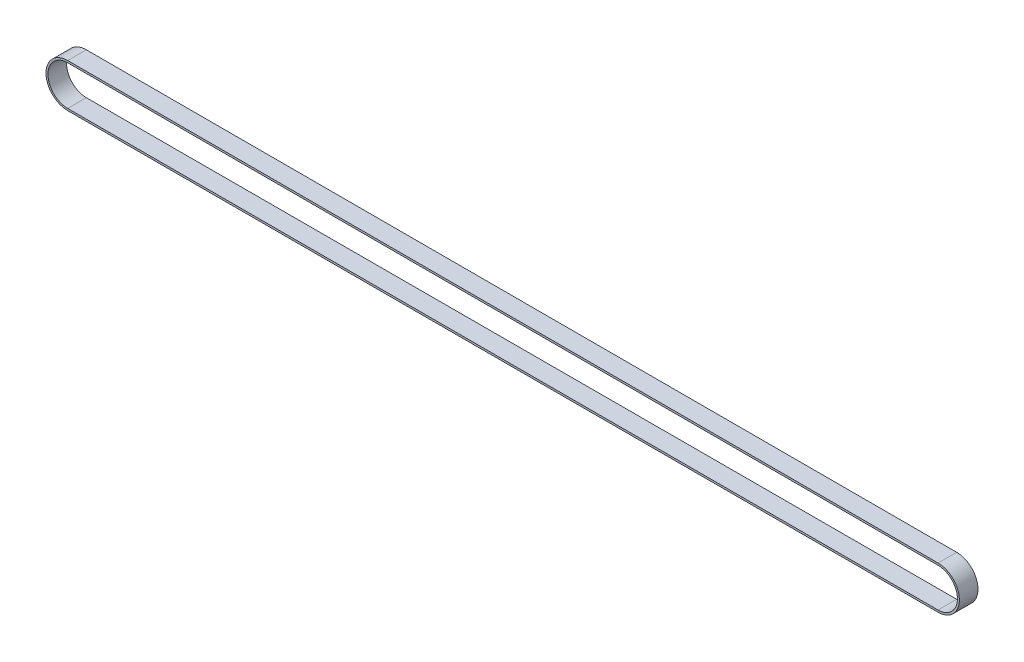
ISO-10303-21;
HEADER;
FILE_DESCRIPTION(('STEP AP214'),'2;1');
FILE_NAME('part.step','',(''),(''),'','','');
FILE_SCHEMA(('AUTOMOTIVE_DESIGN { 1 0 10303 214 1 1 1 1 }'));
ENDSEC;
DATA;
#1=APPLICATION_CONTEXT('core data for automotive mechanical design processes');
#2=APPLICATION_PROTOCOL_DEFINITION('international standard','automotive_design',2000,#1);
#3=PRODUCT_CONTEXT('',#1,'mechanical');
#4=PRODUCT('Part','Part','',(#3));
#5=PRODUCT_RELATED_PRODUCT_CATEGORY('part','',(#4));
#6=PRODUCT_DEFINITION_FORMATION('','',#4);
#7=PRODUCT_DEFINITION_CONTEXT('part definition',#1,'design');
#8=PRODUCT_DEFINITION('design','',#6,#7);
#9=PRODUCT_DEFINITION_SHAPE('','',#8);
#10=(LENGTH_UNIT() NAMED_UNIT(*) SI_UNIT(.MILLI.,.METRE.));
#11=(NAMED_UNIT(*) PLANE_ANGLE_UNIT() SI_UNIT($,.RADIAN.));
#12=(NAMED_UNIT(*) SI_UNIT($,.STERADIAN.) SOLID_ANGLE_UNIT());
#13=UNCERTAINTY_MEASURE_WITH_UNIT(LENGTH_MEASURE(1.E-05),#10,'distance_accuracy_value','');
#14=(GEOMETRIC_REPRESENTATION_CONTEXT(3) GLOBAL_UNCERTAINTY_ASSIGNED_CONTEXT((#13)) GLOBAL_UNIT_ASSIGNED_CONTEXT((#10,
#11,#12)) REPRESENTATION_CONTEXT('',''));
#15=CARTESIAN_POINT('',(0.,0.,0.));
#16=DIRECTION('',(0.,0.,1.));
#17=DIRECTION('',(1.,0.,0.));
#18=AXIS2_PLACEMENT_3D('',#15,#16,#17);
#19=CARTESIAN_POINT('',(255.647230169693,0.116512672383148,6.));
#20=DIRECTION('',(0.,0.,1.));
#21=DIRECTION('',(1.,0.,0.));
#22=AXIS2_PLACEMENT_3D('',#19,#20,#21);
#23=PLANE('',#22);
#24=CARTESIAN_POINT('',(255.647230169693,0.116512672383148,6.));
#25=DIRECTION('',(0.,0.,1.));
#26=DIRECTION('',(1.,0.,0.));
#27=AXIS2_PLACEMENT_3D('',#24,#25,#26);
#28=CIRCLE('',#27,6.87);
#29=CARTESIAN_POINT('',(255.653404279592,-6.75348455326163,6.));
#30=VERTEX_POINT('',#29);
#31=CARTESIAN_POINT('',(255.647230169693,6.98651267238315,6.));
#32=VERTEX_POINT('',#31);
#33=EDGE_CURVE('E138',#30,#32,#28,.T.);
#34=ORIENTED_EDGE('',*,*,#33,.T.);
#35=DIRECTION('',(-1.,0.,0.));
#36=VECTOR('',#35,1.);
#37=CARTESIAN_POINT('',(255.647230169693,6.98651267238315,6.));
#38=LINE('',#37,#36);
#39=CARTESIAN_POINT('',(-24.7527415207478,6.98651267238314,6.));
#40=VERTEX_POINT('',#39);
#41=EDGE_CURVE('E141',#32,#40,#38,.T.);
#42=ORIENTED_EDGE('',*,*,#41,.T.);
#43=CARTESIAN_POINT('',(-24.7527415207478,-0.00948732761685278,6.));
#44=DIRECTION('',(0.,0.,1.));
#45=DIRECTION('',(1.,0.,0.));
#46=AXIS2_PLACEMENT_3D('',#43,#44,#45);
#47=CIRCLE('',#46,6.996);
#48=CARTESIAN_POINT('',(-24.7527415207478,-7.00548732761685,6.));
#49=VERTEX_POINT('',#48);
#50=EDGE_CURVE('E144',#40,#49,#47,.T.);
#51=ORIENTED_EDGE('',*,*,#50,.T.);
#52=DIRECTION('',(0.999999596163723,0.000898705953352359,0.));
#53=VECTOR('',#52,1.);
#54=CARTESIAN_POINT('',(-24.7527415207478,-7.00548732761685,6.));
#55=LINE('',#54,#53);
#56=EDGE_CURVE('E146',#49,#30,#55,.T.);
#57=ORIENTED_EDGE('',*,*,#56,.T.);
#58=EDGE_LOOP('',(#34,#42,#51,#57));
#59=FACE_BOUND('',#58,.T.);
#60=DIRECTION('',(0.999999596154831,0.000898715847622215,0.));
#61=VECTOR('',#60,1.);
#62=CARTESIAN_POINT('',(-24.7527415207478,-6.37548732761685,6.));
#63=LINE('',#62,#61);
#64=CARTESIAN_POINT('',(-24.7527415207478,-6.37548732761685,6.));
#65=VERTEX_POINT('',#64);
#66=CARTESIAN_POINT('',(255.647230169693,-6.12348732761685,6.));
#67=VERTEX_POINT('',#66);
#68=EDGE_CURVE('E110',#65,#67,#63,.T.);
#69=ORIENTED_EDGE('',*,*,#68,.F.);
#70=CARTESIAN_POINT('',(-24.7527415207478,-0.00948732761685278,6.));
#71=DIRECTION('',(0.,0.,1.));
#72=DIRECTION('',(1.,0.,0.));
#73=AXIS2_PLACEMENT_3D('',#70,#71,#72);
#74=CIRCLE('',#73,6.366);
#75=CARTESIAN_POINT('',(-24.7527415207478,6.35651267238315,6.));
#76=VERTEX_POINT('',#75);
#77=EDGE_CURVE('E102',#76,#65,#74,.T.);
#78=ORIENTED_EDGE('',*,*,#77,.F.);
#79=DIRECTION('',(-1.,0.,0.));
#80=VECTOR('',#79,1.);
#81=CARTESIAN_POINT('',(-24.7527415207478,6.35651267238315,6.));
#82=LINE('',#81,#80);
#83=CARTESIAN_POINT('',(255.647230169693,6.35651267238315,6.));
#84=VERTEX_POINT('',#83);
#85=EDGE_CURVE('E124',#84,#76,#82,.T.);
#86=ORIENTED_EDGE('',*,*,#85,.F.);
#87=CARTESIAN_POINT('',(255.647230169693,0.116512672383148,6.));
#88=DIRECTION('',(0.,0.,1.));
#89=DIRECTION('',(1.,0.,0.));
#90=AXIS2_PLACEMENT_3D('',#87,#88,#89);
#91=CIRCLE('',#90,6.24);
#92=EDGE_CURVE('E122',#67,#84,#91,.T.);
#93=ORIENTED_EDGE('',*,*,#92,.F.);
#94=EDGE_LOOP('',(#69,#78,#86,#93));
#95=FACE_BOUND('',#94,.T.);
#96=ADVANCED_FACE('F37',(#59,#95),#23,.T.);
#97=CARTESIAN_POINT('',(255.647230169693,0.116512672383148,0.));
#98=DIRECTION('',(0.,0.,1.));
#99=DIRECTION('',(1.,0.,0.));
#100=AXIS2_PLACEMENT_3D('',#97,#98,#99);
#101=PLANE('',#100);
#102=CARTESIAN_POINT('',(255.647230169693,0.116512672383148,0.));
#103=DIRECTION('',(0.,0.,1.));
#104=DIRECTION('',(1.,0.,0.));
#105=AXIS2_PLACEMENT_3D('',#102,#103,#104);
#106=CIRCLE('',#105,6.87);
#107=CARTESIAN_POINT('',(255.653404279592,-6.75348455326163,0.));
#108=VERTEX_POINT('',#107);
#109=CARTESIAN_POINT('',(255.647230169693,6.98651267238315,0.));
#110=VERTEX_POINT('',#109);
#111=EDGE_CURVE('E118',#108,#110,#106,.T.);
#112=ORIENTED_EDGE('',*,*,#111,.F.);
#113=DIRECTION('',(0.999999596163723,0.000898705953352359,0.));
#114=VECTOR('',#113,1.);
#115=CARTESIAN_POINT('',(-24.7527415207478,-7.00548732761685,0.));
#116=LINE('',#115,#114);
#117=CARTESIAN_POINT('',(-24.7527415207478,-7.00548732761685,0.));
#118=VERTEX_POINT('',#117);
#119=EDGE_CURVE('E142',#118,#108,#116,.T.);
#120=ORIENTED_EDGE('',*,*,#119,.F.);
#121=CARTESIAN_POINT('',(-24.7527415207478,-0.00948732761685278,0.));
#122=DIRECTION('',(0.,0.,1.));
#123=DIRECTION('',(1.,0.,0.));
#124=AXIS2_PLACEMENT_3D('',#121,#122,#123);
#125=CIRCLE('',#124,6.996);
#126=CARTESIAN_POINT('',(-24.7527415207478,6.98651267238314,0.));
#127=VERTEX_POINT('',#126);
#128=EDGE_CURVE('E153',#127,#118,#125,.T.);
#129=ORIENTED_EDGE('',*,*,#128,.F.);
#130=DIRECTION('',(-1.,0.,0.));
#131=VECTOR('',#130,1.);
#132=CARTESIAN_POINT('',(255.647230169693,6.98651267238315,0.));
#133=LINE('',#132,#131);
#134=EDGE_CURVE('E151',#110,#127,#133,.T.);
#135=ORIENTED_EDGE('',*,*,#134,.F.);
#136=EDGE_LOOP('',(#112,#120,#129,#135));
#137=FACE_BOUND('',#136,.T.);
#138=CARTESIAN_POINT('',(-24.7527415207478,-0.00948732761685278,0.));
#139=DIRECTION('',(0.,0.,1.));
#140=DIRECTION('',(1.,0.,0.));
#141=AXIS2_PLACEMENT_3D('',#138,#139,#140);
#142=CIRCLE('',#141,6.366);
#143=CARTESIAN_POINT('',(-24.7527415207479,6.35651267238315,0.));
#144=VERTEX_POINT('',#143);
#145=CARTESIAN_POINT('',(-24.7527415207478,-6.37548732761685,0.));
#146=VERTEX_POINT('',#145);
#147=EDGE_CURVE('E60',#144,#146,#142,.T.);
#148=ORIENTED_EDGE('',*,*,#147,.T.);
#149=DIRECTION('',(0.999999596154831,0.000898715847622215,0.));
#150=VECTOR('',#149,1.);
#151=CARTESIAN_POINT('',(-24.7527415207478,-6.37548732761685,0.));
#152=LINE('',#151,#150);
#153=CARTESIAN_POINT('',(255.647230169693,-6.12348732761685,0.));
#154=VERTEX_POINT('',#153);
#155=EDGE_CURVE('E117',#146,#154,#152,.T.);
#156=ORIENTED_EDGE('',*,*,#155,.T.);
#157=CARTESIAN_POINT('',(255.647230169693,0.116512672383148,0.));
#158=DIRECTION('',(0.,0.,1.));
#159=DIRECTION('',(1.,0.,0.));
#160=AXIS2_PLACEMENT_3D('',#157,#158,#159);
#161=CIRCLE('',#160,6.24);
#162=CARTESIAN_POINT('',(255.647230169693,6.35651267238315,0.));
#163=VERTEX_POINT('',#162);
#164=EDGE_CURVE('E130',#154,#163,#161,.T.);
#165=ORIENTED_EDGE('',*,*,#164,.T.);
#166=DIRECTION('',(-1.,0.,0.));
#167=VECTOR('',#166,1.);
#168=CARTESIAN_POINT('',(-24.7527415207478,6.35651267238315,0.));
#169=LINE('',#168,#167);
#170=EDGE_CURVE('E111',#163,#144,#169,.T.);
#171=ORIENTED_EDGE('',*,*,#170,.T.);
#172=EDGE_LOOP('',(#148,#156,#165,#171));
#173=FACE_BOUND('',#172,.T.);
#174=ADVANCED_FACE('F171',(#137,#173),#101,.F.);
#175=CARTESIAN_POINT('',(255.647230169693,0.116512672383148,6.));
#176=DIRECTION('',(0.,0.,-1.));
#177=DIRECTION('',(-1.,0.,0.));
#178=AXIS2_PLACEMENT_3D('',#175,#176,#177);
#179=CYLINDRICAL_SURFACE('',#178,6.87);
#180=ORIENTED_EDGE('',*,*,#111,.T.);
#181=DIRECTION('',(0.,0.,-1.));
#182=VECTOR('',#181,1.);
#183=CARTESIAN_POINT('',(255.647230169693,6.98651267238315,6.));
#184=LINE('',#183,#182);
#185=EDGE_CURVE('E11',#32,#110,#184,.T.);
#186=ORIENTED_EDGE('',*,*,#185,.F.);
#187=ORIENTED_EDGE('',*,*,#33,.F.);
#188=DIRECTION('',(0.,0.,-1.));
#189=VECTOR('',#188,1.);
#190=CARTESIAN_POINT('',(255.653404279592,-6.75348455326163,6.));
#191=LINE('',#190,#189);
#192=EDGE_CURVE('E148',#30,#108,#191,.T.);
#193=ORIENTED_EDGE('',*,*,#192,.T.);
#194=EDGE_LOOP('',(#180,#186,#187,#193));
#195=FACE_BOUND('',#194,.T.);
#196=ADVANCED_FACE('F39',(#195),#179,.T.);
#197=CARTESIAN_POINT('',(255.647230169693,6.98651267238315,6.));
#198=DIRECTION('',(0.,-1.,0.));
#199=DIRECTION('',(1.,0.,0.));
#200=AXIS2_PLACEMENT_3D('',#197,#198,#199);
#201=PLANE('',#200);
#202=ORIENTED_EDGE('',*,*,#134,.T.);
#203=DIRECTION('',(0.,0.,-1.));
#204=VECTOR('',#203,1.);
#205=CARTESIAN_POINT('',(-24.7527415207478,6.98651267238314,6.));
#206=LINE('',#205,#204);
#207=EDGE_CURVE('E45',#40,#127,#206,.T.);
#208=ORIENTED_EDGE('',*,*,#207,.F.);
#209=ORIENTED_EDGE('',*,*,#41,.F.);
#210=ORIENTED_EDGE('',*,*,#185,.T.);
#211=EDGE_LOOP('',(#202,#208,#209,#210));
#212=FACE_BOUND('',#211,.T.);
#213=ADVANCED_FACE('F181',(#212),#201,.F.);
#214=CARTESIAN_POINT('',(-24.7527415207478,-0.00948732761685278,6.));
#215=DIRECTION('',(0.,0.,-1.));
#216=DIRECTION('',(-1.,0.,0.));
#217=AXIS2_PLACEMENT_3D('',#214,#215,#216);
#218=CYLINDRICAL_SURFACE('',#217,6.996);
#219=ORIENTED_EDGE('',*,*,#128,.T.);
#220=DIRECTION('',(0.,0.,-1.));
#221=VECTOR('',#220,1.);
#222=CARTESIAN_POINT('',(-24.7527415207478,-7.00548732761685,6.));
#223=LINE('',#222,#221);
#224=EDGE_CURVE('E158',#49,#118,#223,.T.);
#225=ORIENTED_EDGE('',*,*,#224,.F.);
#226=ORIENTED_EDGE('',*,*,#50,.F.);
#227=ORIENTED_EDGE('',*,*,#207,.T.);
#228=EDGE_LOOP('',(#219,#225,#226,#227));
#229=FACE_BOUND('',#228,.T.);
#230=ADVANCED_FACE('F165',(#229),#218,.T.);
#231=CARTESIAN_POINT('',(-24.7527415207478,-7.00548732761685,6.));
#232=DIRECTION('',(-0.000898705953352358,0.999999596163723,0.));
#233=DIRECTION('',(-0.999999596163723,-0.000898705953352359,0.));
#234=AXIS2_PLACEMENT_3D('',#231,#232,#233);
#235=PLANE('',#234);
#236=ORIENTED_EDGE('',*,*,#119,.T.);
#237=ORIENTED_EDGE('',*,*,#192,.F.);
#238=ORIENTED_EDGE('',*,*,#56,.F.);
#239=ORIENTED_EDGE('',*,*,#224,.T.);
#240=EDGE_LOOP('',(#236,#237,#238,#239));
#241=FACE_BOUND('',#240,.T.);
#242=ADVANCED_FACE('F175',(#241),#235,.F.);
#243=CARTESIAN_POINT('',(-24.7527415207478,-0.00948732761685278,6.));
#244=DIRECTION('',(0.,0.,-1.));
#245=DIRECTION('',(-1.,0.,0.));
#246=AXIS2_PLACEMENT_3D('',#243,#244,#245);
#247=CYLINDRICAL_SURFACE('',#246,6.366);
#248=ORIENTED_EDGE('',*,*,#147,.F.);
#249=DIRECTION('',(0.,0.,-1.));
#250=VECTOR('',#249,1.);
#251=CARTESIAN_POINT('',(-24.7527415207478,6.35651267238315,6.));
#252=LINE('',#251,#250);
#253=EDGE_CURVE('E106',#76,#144,#252,.T.);
#254=ORIENTED_EDGE('',*,*,#253,.F.);
#255=ORIENTED_EDGE('',*,*,#77,.T.);
#256=DIRECTION('',(0.,0.,-1.));
#257=VECTOR('',#256,1.);
#258=CARTESIAN_POINT('',(-24.7527415207478,-6.37548732761685,6.));
#259=LINE('',#258,#257);
#260=EDGE_CURVE('E105',#65,#146,#259,.T.);
#261=ORIENTED_EDGE('',*,*,#260,.T.);
#262=EDGE_LOOP('',(#248,#254,#255,#261));
#263=FACE_BOUND('',#262,.T.);
#264=ADVANCED_FACE('F104',(#263),#247,.F.);
#265=CARTESIAN_POINT('',(-24.7527415207478,-6.37548732761685,6.));
#266=DIRECTION('',(-0.000898715847622215,0.999999596154831,0.));
#267=DIRECTION('',(-0.999999596154831,-0.000898715847622215,0.));
#268=AXIS2_PLACEMENT_3D('',#265,#266,#267);
#269=PLANE('',#268);
#270=ORIENTED_EDGE('',*,*,#155,.F.);
#271=ORIENTED_EDGE('',*,*,#260,.F.);
#272=ORIENTED_EDGE('',*,*,#68,.T.);
#273=DIRECTION('',(0.,0.,-1.));
#274=VECTOR('',#273,1.);
#275=CARTESIAN_POINT('',(255.647230169693,-6.12348732761685,6.));
#276=LINE('',#275,#274);
#277=EDGE_CURVE('E119',#67,#154,#276,.T.);
#278=ORIENTED_EDGE('',*,*,#277,.T.);
#279=EDGE_LOOP('',(#270,#271,#272,#278));
#280=FACE_BOUND('',#279,.T.);
#281=ADVANCED_FACE('F114',(#280),#269,.T.);
#282=CARTESIAN_POINT('',(255.647230169693,0.116512672383148,6.));
#283=DIRECTION('',(0.,0.,-1.));
#284=DIRECTION('',(-1.,0.,0.));
#285=AXIS2_PLACEMENT_3D('',#282,#283,#284);
#286=CYLINDRICAL_SURFACE('',#285,6.24);
#287=ORIENTED_EDGE('',*,*,#164,.F.);
#288=ORIENTED_EDGE('',*,*,#277,.F.);
#289=ORIENTED_EDGE('',*,*,#92,.T.);
#290=DIRECTION('',(0.,0.,-1.));
#291=VECTOR('',#290,1.);
#292=CARTESIAN_POINT('',(255.647230169693,6.35651267238315,6.));
#293=LINE('',#292,#291);
#294=EDGE_CURVE('E52',#84,#163,#293,.T.);
#295=ORIENTED_EDGE('',*,*,#294,.T.);
#296=EDGE_LOOP('',(#287,#288,#289,#295));
#297=FACE_BOUND('',#296,.T.);
#298=ADVANCED_FACE('F204',(#297),#286,.F.);
#299=CARTESIAN_POINT('',(-24.7527415207478,6.35651267238315,6.));
#300=DIRECTION('',(0.,-1.,0.));
#301=DIRECTION('',(0.,0.,-1.));
#302=AXIS2_PLACEMENT_3D('',#299,#300,#301);
#303=PLANE('',#302);
#304=ORIENTED_EDGE('',*,*,#170,.F.);
#305=ORIENTED_EDGE('',*,*,#294,.F.);
#306=ORIENTED_EDGE('',*,*,#85,.T.);
#307=ORIENTED_EDGE('',*,*,#253,.T.);
#308=EDGE_LOOP('',(#304,#305,#306,#307));
#309=FACE_BOUND('',#308,.T.);
#310=ADVANCED_FACE('F208',(#309),#303,.T.);
#311=CLOSED_SHELL('',(#96,#174,#196,#213,#230,#242,#264,#281,#298,#310));
#312=MANIFOLD_SOLID_BREP('B2',#311);
#313=ADVANCED_BREP_SHAPE_REPRESENTATION('',(#18,#312),#14);
#314=SHAPE_DEFINITION_REPRESENTATION(#9,#313);
ENDSEC;
END-ISO-10303-21;
